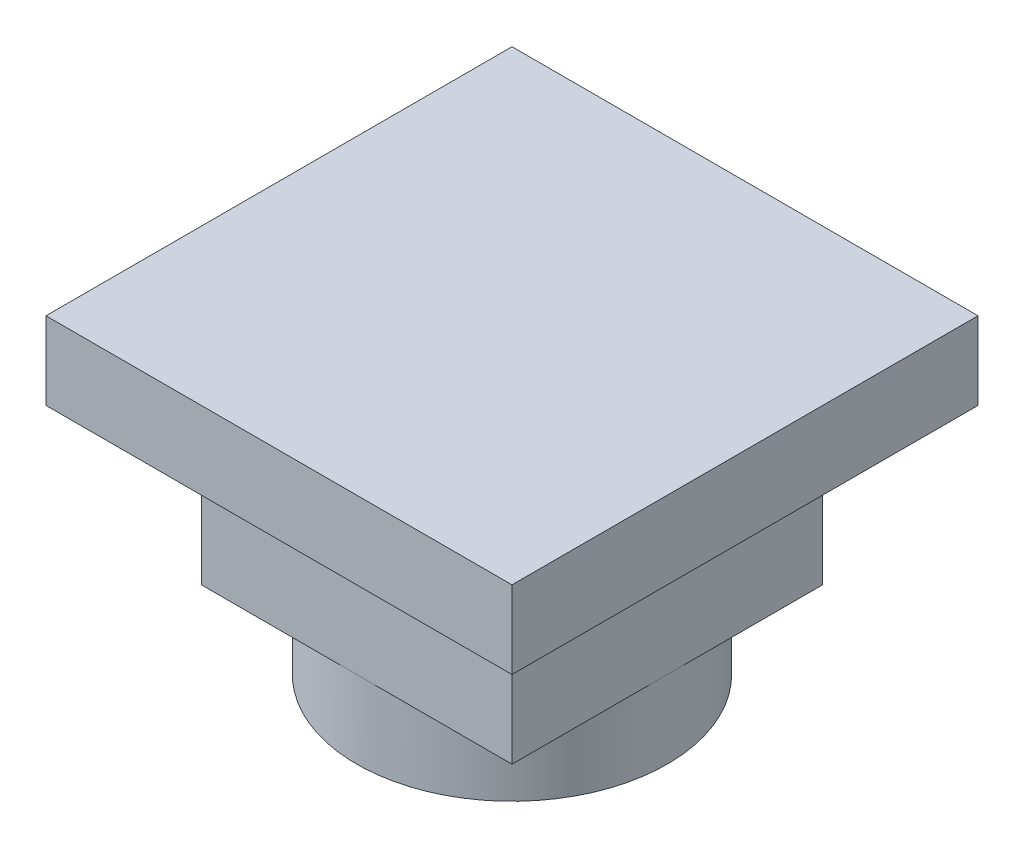
ISO-10303-21;
HEADER;
FILE_DESCRIPTION(('STEP AP214'),'2;1');
FILE_NAME('part.step','',(''),(''),'','','');
FILE_SCHEMA(('AUTOMOTIVE_DESIGN { 1 0 10303 214 1 1 1 1 }'));
ENDSEC;
DATA;
#1=APPLICATION_CONTEXT('core data for automotive mechanical design processes');
#2=APPLICATION_PROTOCOL_DEFINITION('international standard','automotive_design',2000,#1);
#3=PRODUCT_CONTEXT('',#1,'mechanical');
#4=PRODUCT('Part','Part','',(#3));
#5=PRODUCT_RELATED_PRODUCT_CATEGORY('part','',(#4));
#6=PRODUCT_DEFINITION_FORMATION('','',#4);
#7=PRODUCT_DEFINITION_CONTEXT('part definition',#1,'design');
#8=PRODUCT_DEFINITION('design','',#6,#7);
#9=PRODUCT_DEFINITION_SHAPE('','',#8);
#10=(LENGTH_UNIT() NAMED_UNIT(*) SI_UNIT(.MILLI.,.METRE.));
#11=(NAMED_UNIT(*) PLANE_ANGLE_UNIT() SI_UNIT($,.RADIAN.));
#12=(NAMED_UNIT(*) SI_UNIT($,.STERADIAN.) SOLID_ANGLE_UNIT());
#13=UNCERTAINTY_MEASURE_WITH_UNIT(LENGTH_MEASURE(1.E-05),#10,'distance_accuracy_value','');
#14=(GEOMETRIC_REPRESENTATION_CONTEXT(3) GLOBAL_UNCERTAINTY_ASSIGNED_CONTEXT((#13)) GLOBAL_UNIT_ASSIGNED_CONTEXT((#10,
#11,#12)) REPRESENTATION_CONTEXT('',''));
#15=CARTESIAN_POINT('',(0.,0.,0.));
#16=DIRECTION('',(0.,0.,1.));
#17=DIRECTION('',(1.,0.,0.));
#18=AXIS2_PLACEMENT_3D('',#15,#16,#17);
#19=CARTESIAN_POINT('',(0.,-1.79536470692457,0.));
#20=DIRECTION('',(0.,-1.,0.));
#21=DIRECTION('',(0.,0.,-1.));
#22=AXIS2_PLACEMENT_3D('',#19,#20,#21);
#23=PLANE('',#22);
#24=CARTESIAN_POINT('',(0.,-1.79536470692457,0.));
#25=DIRECTION('',(0.,-1.,0.));
#26=DIRECTION('',(0.,0.,-1.));
#27=AXIS2_PLACEMENT_3D('',#24,#25,#26);
#28=CIRCLE('',#27,3.);
#29=CARTESIAN_POINT('',(0.,-1.79536470692457,-3.));
#30=VERTEX_POINT('',#29);
#31=CARTESIAN_POINT('',(3.,-1.79536470692457,0.));
#32=VERTEX_POINT('',#31);
#33=EDGE_CURVE('E50',#30,#32,#28,.T.);
#34=ORIENTED_EDGE('',*,*,#33,.F.);
#35=DIRECTION('',(-1.,0.,0.));
#36=VECTOR('',#35,1.);
#37=CARTESIAN_POINT('',(-3.,-1.79536470692457,-3.));
#38=LINE('',#37,#36);
#39=CARTESIAN_POINT('',(3.,-1.79536470692457,-3.));
#40=VERTEX_POINT('',#39);
#41=EDGE_CURVE('E121',#40,#30,#38,.T.);
#42=ORIENTED_EDGE('',*,*,#41,.F.);
#43=DIRECTION('',(0.,0.,-1.));
#44=VECTOR('',#43,1.);
#45=CARTESIAN_POINT('',(3.,-1.79536470692457,3.));
#46=LINE('',#45,#44);
#47=EDGE_CURVE('E138',#32,#40,#46,.T.);
#48=ORIENTED_EDGE('',*,*,#47,.F.);
#49=EDGE_LOOP('',(#34,#42,#48));
#50=FACE_BOUND('',#49,.T.);
#51=ADVANCED_FACE('F38',(#50),#23,.T.);
#52=CARTESIAN_POINT('',(0.,-1.79536470692457,3.));
#53=VERTEX_POINT('',#52);
#54=EDGE_CURVE('E11',#32,#53,#28,.T.);
#55=ORIENTED_EDGE('',*,*,#54,.F.);
#56=CARTESIAN_POINT('',(3.,-1.79536470692457,3.));
#57=VERTEX_POINT('',#56);
#58=EDGE_CURVE('E136',#57,#32,#46,.T.);
#59=ORIENTED_EDGE('',*,*,#58,.F.);
#60=DIRECTION('',(1.,0.,0.));
#61=VECTOR('',#60,1.);
#62=CARTESIAN_POINT('',(-3.,-1.79536470692457,3.));
#63=LINE('',#62,#61);
#64=EDGE_CURVE('E214',#53,#57,#63,.T.);
#65=ORIENTED_EDGE('',*,*,#64,.F.);
#66=EDGE_LOOP('',(#55,#59,#65));
#67=FACE_BOUND('',#66,.T.);
#68=ADVANCED_FACE('F238',(#67),#23,.T.);
#69=CARTESIAN_POINT('',(-3.,-1.79536470692457,0.));
#70=VERTEX_POINT('',#69);
#71=EDGE_CURVE('E48',#53,#70,#28,.T.);
#72=ORIENTED_EDGE('',*,*,#71,.F.);
#73=CARTESIAN_POINT('',(-3.,-1.79536470692457,3.));
#74=VERTEX_POINT('',#73);
#75=EDGE_CURVE('E197',#74,#53,#63,.T.);
#76=ORIENTED_EDGE('',*,*,#75,.F.);
#77=DIRECTION('',(0.,0.,1.));
#78=VECTOR('',#77,1.);
#79=CARTESIAN_POINT('',(-3.,-1.79536470692457,3.));
#80=LINE('',#79,#78);
#81=EDGE_CURVE('E130',#70,#74,#80,.T.);
#82=ORIENTED_EDGE('',*,*,#81,.F.);
#83=EDGE_LOOP('',(#72,#76,#82));
#84=FACE_BOUND('',#83,.T.);
#85=ADVANCED_FACE('F240',(#84),#23,.T.);
#86=CARTESIAN_POINT('',(3.,1.20463529307543,3.));
#87=DIRECTION('',(-1.,0.,0.));
#88=DIRECTION('',(0.,0.,1.));
#89=AXIS2_PLACEMENT_3D('',#86,#87,#88);
#90=PLANE('',#89);
#91=ORIENTED_EDGE('',*,*,#58,.T.);
#92=ORIENTED_EDGE('',*,*,#47,.T.);
#93=DIRECTION('',(0.,-1.,0.));
#94=VECTOR('',#93,1.);
#95=CARTESIAN_POINT('',(3.,1.20463529307543,-3.));
#96=LINE('',#95,#94);
#97=CARTESIAN_POINT('',(3.,1.20463529307543,-3.));
#98=VERTEX_POINT('',#97);
#99=EDGE_CURVE('E42',#98,#40,#96,.T.);
#100=ORIENTED_EDGE('',*,*,#99,.F.);
#101=DIRECTION('',(0.,0.,-1.));
#102=VECTOR('',#101,1.);
#103=CARTESIAN_POINT('',(3.,1.20463529307543,3.));
#104=LINE('',#103,#102);
#105=CARTESIAN_POINT('',(3.,1.20463529307543,3.));
#106=VERTEX_POINT('',#105);
#107=EDGE_CURVE('E192',#106,#98,#104,.T.);
#108=ORIENTED_EDGE('',*,*,#107,.F.);
#109=DIRECTION('',(0.,-1.,0.));
#110=VECTOR('',#109,1.);
#111=CARTESIAN_POINT('',(3.,1.20463529307543,3.));
#112=LINE('',#111,#110);
#113=EDGE_CURVE('E209',#106,#57,#112,.T.);
#114=ORIENTED_EDGE('',*,*,#113,.T.);
#115=EDGE_LOOP('',(#91,#92,#100,#108,#114));
#116=FACE_BOUND('',#115,.T.);
#117=ADVANCED_FACE('F40',(#116),#90,.F.);
#118=CARTESIAN_POINT('',(-3.,1.20463529307543,-3.));
#119=DIRECTION('',(0.,0.,1.));
#120=DIRECTION('',(1.,0.,0.));
#121=AXIS2_PLACEMENT_3D('',#118,#119,#120);
#122=PLANE('',#121);
#123=ORIENTED_EDGE('',*,*,#41,.T.);
#124=CARTESIAN_POINT('',(-3.,-1.79536470692457,-3.));
#125=VERTEX_POINT('',#124);
#126=EDGE_CURVE('E123',#30,#125,#38,.T.);
#127=ORIENTED_EDGE('',*,*,#126,.T.);
#128=DIRECTION('',(0.,-1.,0.));
#129=VECTOR('',#128,1.);
#130=CARTESIAN_POINT('',(-3.,1.20463529307543,-3.));
#131=LINE('',#130,#129);
#132=CARTESIAN_POINT('',(-3.,1.20463529307543,-3.));
#133=VERTEX_POINT('',#132);
#134=EDGE_CURVE('E147',#133,#125,#131,.T.);
#135=ORIENTED_EDGE('',*,*,#134,.F.);
#136=DIRECTION('',(-1.,0.,0.));
#137=VECTOR('',#136,1.);
#138=CARTESIAN_POINT('',(-3.,1.20463529307543,-3.));
#139=LINE('',#138,#137);
#140=EDGE_CURVE('E196',#98,#133,#139,.T.);
#141=ORIENTED_EDGE('',*,*,#140,.F.);
#142=ORIENTED_EDGE('',*,*,#99,.T.);
#143=EDGE_LOOP('',(#123,#127,#135,#141,#142));
#144=FACE_BOUND('',#143,.T.);
#145=ADVANCED_FACE('F122',(#144),#122,.F.);
#146=CARTESIAN_POINT('',(-3.,1.20463529307543,3.));
#147=DIRECTION('',(1.,0.,0.));
#148=DIRECTION('',(0.,0.,-1.));
#149=AXIS2_PLACEMENT_3D('',#146,#147,#148);
#150=PLANE('',#149);
#151=EDGE_CURVE('E134',#125,#70,#80,.T.);
#152=ORIENTED_EDGE('',*,*,#151,.T.);
#153=ORIENTED_EDGE('',*,*,#81,.T.);
#154=DIRECTION('',(0.,-1.,0.));
#155=VECTOR('',#154,1.);
#156=CARTESIAN_POINT('',(-3.,1.20463529307543,3.));
#157=LINE('',#156,#155);
#158=CARTESIAN_POINT('',(-3.,1.20463529307543,3.));
#159=VERTEX_POINT('',#158);
#160=EDGE_CURVE('E221',#159,#74,#157,.T.);
#161=ORIENTED_EDGE('',*,*,#160,.F.);
#162=DIRECTION('',(0.,0.,1.));
#163=VECTOR('',#162,1.);
#164=CARTESIAN_POINT('',(-3.,1.20463529307543,3.));
#165=LINE('',#164,#163);
#166=EDGE_CURVE('E201',#133,#159,#165,.T.);
#167=ORIENTED_EDGE('',*,*,#166,.F.);
#168=ORIENTED_EDGE('',*,*,#134,.T.);
#169=EDGE_LOOP('',(#152,#153,#161,#167,#168));
#170=FACE_BOUND('',#169,.T.);
#171=ADVANCED_FACE('F227',(#170),#150,.F.);
#172=CARTESIAN_POINT('',(-3.,1.20463529307543,3.));
#173=DIRECTION('',(0.,0.,-1.));
#174=DIRECTION('',(-1.,0.,0.));
#175=AXIS2_PLACEMENT_3D('',#172,#173,#174);
#176=PLANE('',#175);
#177=ORIENTED_EDGE('',*,*,#75,.T.);
#178=ORIENTED_EDGE('',*,*,#64,.T.);
#179=ORIENTED_EDGE('',*,*,#113,.F.);
#180=DIRECTION('',(1.,0.,0.));
#181=VECTOR('',#180,1.);
#182=CARTESIAN_POINT('',(-3.,1.20463529307543,3.));
#183=LINE('',#182,#181);
#184=EDGE_CURVE('E205',#159,#106,#183,.T.);
#185=ORIENTED_EDGE('',*,*,#184,.F.);
#186=ORIENTED_EDGE('',*,*,#160,.T.);
#187=EDGE_LOOP('',(#177,#178,#179,#185,#186));
#188=FACE_BOUND('',#187,.T.);
#189=ADVANCED_FACE('F235',(#188),#176,.F.);
#190=EDGE_CURVE('E57',#70,#30,#28,.T.);
#191=ORIENTED_EDGE('',*,*,#190,.F.);
#192=ORIENTED_EDGE('',*,*,#151,.F.);
#193=ORIENTED_EDGE('',*,*,#126,.F.);
#194=EDGE_LOOP('',(#191,#192,#193));
#195=FACE_BOUND('',#194,.T.);
#196=ADVANCED_FACE('F132',(#195),#23,.T.);
#197=CARTESIAN_POINT('',(4.5,2.70463529307543,4.5));
#198=DIRECTION('',(-1.,0.,0.));
#199=DIRECTION('',(0.,0.,1.));
#200=AXIS2_PLACEMENT_3D('',#197,#198,#199);
#201=PLANE('',#200);
#202=DIRECTION('',(0.,0.,-1.));
#203=VECTOR('',#202,1.);
#204=CARTESIAN_POINT('',(4.5,1.20463529307543,4.5));
#205=LINE('',#204,#203);
#206=CARTESIAN_POINT('',(4.5,1.20463529307543,4.5));
#207=VERTEX_POINT('',#206);
#208=CARTESIAN_POINT('',(4.5,1.20463529307543,-4.5));
#209=VERTEX_POINT('',#208);
#210=EDGE_CURVE('E165',#207,#209,#205,.T.);
#211=ORIENTED_EDGE('',*,*,#210,.T.);
#212=DIRECTION('',(0.,-1.,0.));
#213=VECTOR('',#212,1.);
#214=CARTESIAN_POINT('',(4.5,2.70463529307543,-4.5));
#215=LINE('',#214,#213);
#216=CARTESIAN_POINT('',(4.5,2.70463529307543,-4.5));
#217=VERTEX_POINT('',#216);
#218=EDGE_CURVE('E188',#217,#209,#215,.T.);
#219=ORIENTED_EDGE('',*,*,#218,.F.);
#220=DIRECTION('',(0.,0.,-1.));
#221=VECTOR('',#220,1.);
#222=CARTESIAN_POINT('',(4.5,2.70463529307543,4.5));
#223=LINE('',#222,#221);
#224=CARTESIAN_POINT('',(4.5,2.70463529307543,4.5));
#225=VERTEX_POINT('',#224);
#226=EDGE_CURVE('E150',#225,#217,#223,.T.);
#227=ORIENTED_EDGE('',*,*,#226,.F.);
#228=DIRECTION('',(0.,-1.,0.));
#229=VECTOR('',#228,1.);
#230=CARTESIAN_POINT('',(4.5,2.70463529307543,4.5));
#231=LINE('',#230,#229);
#232=EDGE_CURVE('E164',#225,#207,#231,.T.);
#233=ORIENTED_EDGE('',*,*,#232,.T.);
#234=EDGE_LOOP('',(#211,#219,#227,#233));
#235=FACE_BOUND('',#234,.T.);
#236=ADVANCED_FACE('F267',(#235),#201,.F.);
#237=CARTESIAN_POINT('',(-4.5,2.70463529307543,-4.5));
#238=DIRECTION('',(0.,0.,1.));
#239=DIRECTION('',(1.,0.,0.));
#240=AXIS2_PLACEMENT_3D('',#237,#238,#239);
#241=PLANE('',#240);
#242=DIRECTION('',(-1.,0.,0.));
#243=VECTOR('',#242,1.);
#244=CARTESIAN_POINT('',(-4.5,1.20463529307543,-4.5));
#245=LINE('',#244,#243);
#246=CARTESIAN_POINT('',(-4.5,1.20463529307543,-4.5));
#247=VERTEX_POINT('',#246);
#248=EDGE_CURVE('E169',#209,#247,#245,.T.);
#249=ORIENTED_EDGE('',*,*,#248,.T.);
#250=DIRECTION('',(0.,-1.,0.));
#251=VECTOR('',#250,1.);
#252=CARTESIAN_POINT('',(-4.5,2.70463529307543,-4.5));
#253=LINE('',#252,#251);
#254=CARTESIAN_POINT('',(-4.5,2.70463529307543,-4.5));
#255=VERTEX_POINT('',#254);
#256=EDGE_CURVE('E184',#255,#247,#253,.T.);
#257=ORIENTED_EDGE('',*,*,#256,.F.);
#258=DIRECTION('',(-1.,0.,0.));
#259=VECTOR('',#258,1.);
#260=CARTESIAN_POINT('',(-4.5,2.70463529307543,-4.5));
#261=LINE('',#260,#259);
#262=EDGE_CURVE('E154',#217,#255,#261,.T.);
#263=ORIENTED_EDGE('',*,*,#262,.F.);
#264=ORIENTED_EDGE('',*,*,#218,.T.);
#265=EDGE_LOOP('',(#249,#257,#263,#264));
#266=FACE_BOUND('',#265,.T.);
#267=ADVANCED_FACE('F272',(#266),#241,.F.);
#268=CARTESIAN_POINT('',(-4.5,2.70463529307543,4.5));
#269=DIRECTION('',(1.,0.,0.));
#270=DIRECTION('',(0.,0.,-1.));
#271=AXIS2_PLACEMENT_3D('',#268,#269,#270);
#272=PLANE('',#271);
#273=DIRECTION('',(0.,0.,1.));
#274=VECTOR('',#273,1.);
#275=CARTESIAN_POINT('',(-4.5,1.20463529307543,4.5));
#276=LINE('',#275,#274);
#277=CARTESIAN_POINT('',(-4.5,1.20463529307543,4.5));
#278=VERTEX_POINT('',#277);
#279=EDGE_CURVE('E172',#247,#278,#276,.T.);
#280=ORIENTED_EDGE('',*,*,#279,.T.);
#281=DIRECTION('',(0.,-1.,0.));
#282=VECTOR('',#281,1.);
#283=CARTESIAN_POINT('',(-4.5,2.70463529307543,4.5));
#284=LINE('',#283,#282);
#285=CARTESIAN_POINT('',(-4.5,2.70463529307543,4.5));
#286=VERTEX_POINT('',#285);
#287=EDGE_CURVE('E180',#286,#278,#284,.T.);
#288=ORIENTED_EDGE('',*,*,#287,.F.);
#289=DIRECTION('',(0.,0.,1.));
#290=VECTOR('',#289,1.);
#291=CARTESIAN_POINT('',(-4.5,2.70463529307543,4.5));
#292=LINE('',#291,#290);
#293=EDGE_CURVE('E158',#255,#286,#292,.T.);
#294=ORIENTED_EDGE('',*,*,#293,.F.);
#295=ORIENTED_EDGE('',*,*,#256,.T.);
#296=EDGE_LOOP('',(#280,#288,#294,#295));
#297=FACE_BOUND('',#296,.T.);
#298=ADVANCED_FACE('F310',(#297),#272,.F.);
#299=CARTESIAN_POINT('',(-4.5,2.70463529307543,4.5));
#300=DIRECTION('',(0.,0.,-1.));
#301=DIRECTION('',(-1.,0.,0.));
#302=AXIS2_PLACEMENT_3D('',#299,#300,#301);
#303=PLANE('',#302);
#304=DIRECTION('',(1.,0.,0.));
#305=VECTOR('',#304,1.);
#306=CARTESIAN_POINT('',(-4.5,1.20463529307543,4.5));
#307=LINE('',#306,#305);
#308=EDGE_CURVE('E155',#278,#207,#307,.T.);
#309=ORIENTED_EDGE('',*,*,#308,.T.);
#310=ORIENTED_EDGE('',*,*,#232,.F.);
#311=DIRECTION('',(1.,0.,0.));
#312=VECTOR('',#311,1.);
#313=CARTESIAN_POINT('',(-4.5,2.70463529307543,4.5));
#314=LINE('',#313,#312);
#315=EDGE_CURVE('E161',#286,#225,#314,.T.);
#316=ORIENTED_EDGE('',*,*,#315,.F.);
#317=ORIENTED_EDGE('',*,*,#287,.T.);
#318=EDGE_LOOP('',(#309,#310,#316,#317));
#319=FACE_BOUND('',#318,.T.);
#320=ADVANCED_FACE('F320',(#319),#303,.F.);
#321=CARTESIAN_POINT('',(0.,2.70463529307543,0.));
#322=DIRECTION('',(0.,-1.,0.));
#323=DIRECTION('',(0.,0.,-1.));
#324=AXIS2_PLACEMENT_3D('',#321,#322,#323);
#325=PLANE('',#324);
#326=ORIENTED_EDGE('',*,*,#226,.T.);
#327=ORIENTED_EDGE('',*,*,#262,.T.);
#328=ORIENTED_EDGE('',*,*,#293,.T.);
#329=ORIENTED_EDGE('',*,*,#315,.T.);
#330=EDGE_LOOP('',(#326,#327,#328,#329));
#331=FACE_BOUND('',#330,.T.);
#332=ADVANCED_FACE('F256',(#331),#325,.F.);
#333=CARTESIAN_POINT('',(0.,1.20463529307543,0.));
#334=DIRECTION('',(0.,-1.,0.));
#335=DIRECTION('',(0.,0.,-1.));
#336=AXIS2_PLACEMENT_3D('',#333,#334,#335);
#337=PLANE('',#336);
#338=ORIENTED_EDGE('',*,*,#184,.T.);
#339=ORIENTED_EDGE('',*,*,#107,.T.);
#340=ORIENTED_EDGE('',*,*,#140,.T.);
#341=ORIENTED_EDGE('',*,*,#166,.T.);
#342=EDGE_LOOP('',(#338,#339,#340,#341));
#343=FACE_BOUND('',#342,.T.);
#344=ORIENTED_EDGE('',*,*,#210,.F.);
#345=ORIENTED_EDGE('',*,*,#308,.F.);
#346=ORIENTED_EDGE('',*,*,#279,.F.);
#347=ORIENTED_EDGE('',*,*,#248,.F.);
#348=EDGE_LOOP('',(#344,#345,#346,#347));
#349=FACE_BOUND('',#348,.T.);
#350=ADVANCED_FACE('F231',(#343,#349),#337,.T.);
#351=CARTESIAN_POINT('',(0.,-3.29536470692457,0.));
#352=DIRECTION('',(0.,1.,0.));
#353=DIRECTION('',(0.,0.,1.));
#354=AXIS2_PLACEMENT_3D('',#351,#352,#353);
#355=CYLINDRICAL_SURFACE('',#354,3.);
#356=CARTESIAN_POINT('',(0.,-3.29536470692457,0.));
#357=DIRECTION('',(0.,-1.,0.));
#358=DIRECTION('',(0.,0.,-1.));
#359=AXIS2_PLACEMENT_3D('',#356,#357,#358);
#360=CIRCLE('',#359,3.);
#361=CARTESIAN_POINT('',(0.,-3.29536470692457,-3.));
#362=VERTEX_POINT('',#361);
#363=EDGE_CURVE('E142',#362,#362,#360,.T.);
#364=ORIENTED_EDGE('',*,*,#363,.F.);
#365=EDGE_LOOP('',(#364));
#366=FACE_BOUND('',#365,.T.);
#367=ORIENTED_EDGE('',*,*,#33,.T.);
#368=ORIENTED_EDGE('',*,*,#54,.T.);
#369=ORIENTED_EDGE('',*,*,#71,.T.);
#370=ORIENTED_EDGE('',*,*,#190,.T.);
#371=EDGE_LOOP('',(#367,#368,#369,#370));
#372=FACE_BOUND('',#371,.T.);
#373=ADVANCED_FACE('F143',(#366,#372),#355,.T.);
#374=CARTESIAN_POINT('',(0.,-3.29536470692457,0.));
#375=DIRECTION('',(0.,-1.,0.));
#376=DIRECTION('',(0.,0.,-1.));
#377=AXIS2_PLACEMENT_3D('',#374,#375,#376);
#378=PLANE('',#377);
#379=ORIENTED_EDGE('',*,*,#363,.T.);
#380=EDGE_LOOP('',(#379));
#381=FACE_BOUND('',#380,.T.);
#382=ADVANCED_FACE('F247',(#381),#378,.T.);
#383=CLOSED_SHELL('',(#51,#68,#85,#117,#145,#171,#189,#196,#236,#267,#298,#320,#332,#350,#373,#382));
#384=MANIFOLD_SOLID_BREP('B2',#383);
#385=ADVANCED_BREP_SHAPE_REPRESENTATION('',(#18,#384),#14);
#386=SHAPE_DEFINITION_REPRESENTATION(#9,#385);
ENDSEC;
END-ISO-10303-21;
